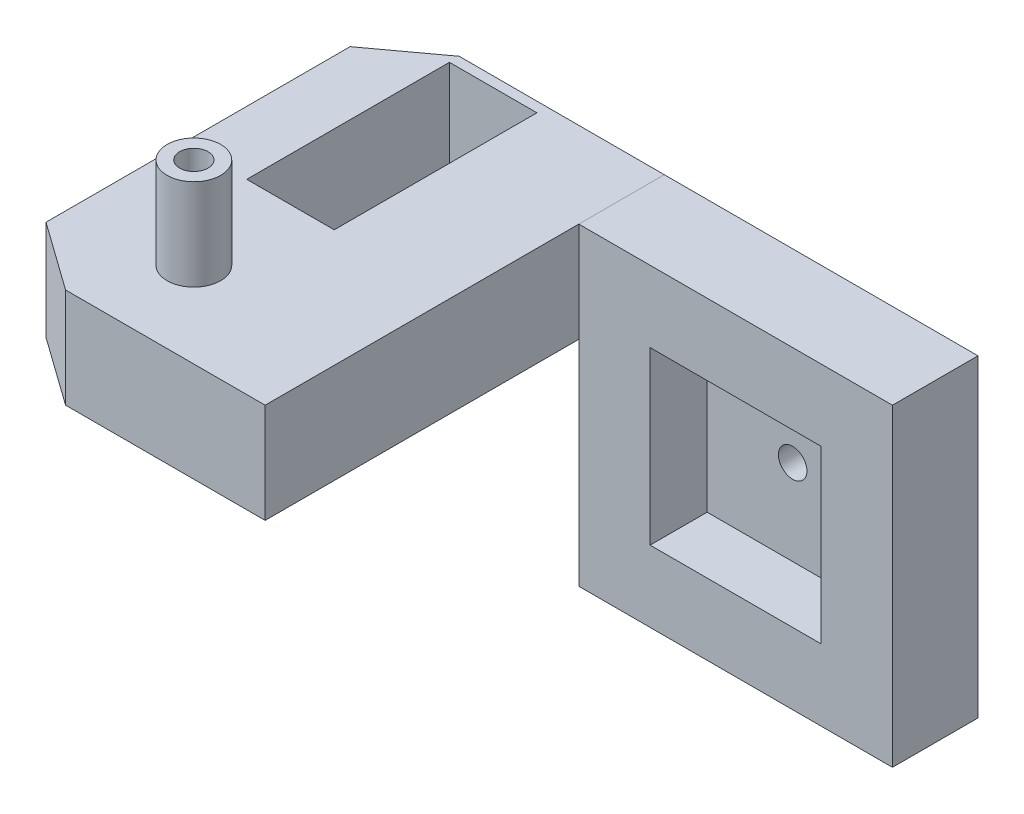
ISO-10303-21;
HEADER;
FILE_DESCRIPTION(('STEP AP214'),'2;1');
FILE_NAME('part.step','',(''),(''),'','','');
FILE_SCHEMA(('AUTOMOTIVE_DESIGN { 1 0 10303 214 1 1 1 1 }'));
ENDSEC;
DATA;
#1=APPLICATION_CONTEXT('core data for automotive mechanical design processes');
#2=APPLICATION_PROTOCOL_DEFINITION('international standard','automotive_design',2000,#1);
#3=PRODUCT_CONTEXT('',#1,'mechanical');
#4=PRODUCT('Part','Part','',(#3));
#5=PRODUCT_RELATED_PRODUCT_CATEGORY('part','',(#4));
#6=PRODUCT_DEFINITION_FORMATION('','',#4);
#7=PRODUCT_DEFINITION_CONTEXT('part definition',#1,'design');
#8=PRODUCT_DEFINITION('design','',#6,#7);
#9=PRODUCT_DEFINITION_SHAPE('','',#8);
#10=(LENGTH_UNIT() NAMED_UNIT(*) SI_UNIT(.MILLI.,.METRE.));
#11=(NAMED_UNIT(*) PLANE_ANGLE_UNIT() SI_UNIT($,.RADIAN.));
#12=(NAMED_UNIT(*) SI_UNIT($,.STERADIAN.) SOLID_ANGLE_UNIT());
#13=UNCERTAINTY_MEASURE_WITH_UNIT(LENGTH_MEASURE(1.E-05),#10,'distance_accuracy_value','');
#14=(GEOMETRIC_REPRESENTATION_CONTEXT(3) GLOBAL_UNCERTAINTY_ASSIGNED_CONTEXT((#13)) GLOBAL_UNIT_ASSIGNED_CONTEXT((#10,
#11,#12)) REPRESENTATION_CONTEXT('',''));
#15=CARTESIAN_POINT('',(0.,0.,0.));
#16=DIRECTION('',(0.,0.,1.));
#17=DIRECTION('',(1.,0.,0.));
#18=AXIS2_PLACEMENT_3D('',#15,#16,#17);
#19=CARTESIAN_POINT('',(-41.2496020360594,-0.64025842156578,70.));
#20=DIRECTION('',(0.,0.,1.));
#21=DIRECTION('',(1.,0.,0.));
#22=AXIS2_PLACEMENT_3D('',#19,#20,#21);
#23=PLANE('',#22);
#24=DIRECTION('',(1.,0.,0.));
#25=VECTOR('',#24,1.);
#26=CARTESIAN_POINT('',(-41.2496020360594,16.8597415784342,70.));
#27=LINE('',#26,#25);
#28=CARTESIAN_POINT('',(-76.2496020360593,16.8597415784342,70.));
#29=VERTEX_POINT('',#28);
#30=CARTESIAN_POINT('',(-41.2496020360594,16.8597415784342,70.));
#31=VERTEX_POINT('',#30);
#32=EDGE_CURVE('E241',#29,#31,#27,.T.);
#33=ORIENTED_EDGE('',*,*,#32,.F.);
#34=DIRECTION('',(0.,1.,0.));
#35=VECTOR('',#34,1.);
#36=CARTESIAN_POINT('',(-76.2496020360593,-38.1402584215658,70.));
#37=LINE('',#36,#35);
#38=CARTESIAN_POINT('',(-76.2496020360593,-0.64025842156578,70.));
#39=VERTEX_POINT('',#38);
#40=EDGE_CURVE('E216',#39,#29,#37,.T.);
#41=ORIENTED_EDGE('',*,*,#40,.F.);
#42=DIRECTION('',(1.,0.,0.));
#43=VECTOR('',#42,1.);
#44=CARTESIAN_POINT('',(-41.2496020360594,-0.64025842156578,70.));
#45=LINE('',#44,#43);
#46=CARTESIAN_POINT('',(-41.2496020360594,-0.64025842156578,70.));
#47=VERTEX_POINT('',#46);
#48=EDGE_CURVE('E244',#39,#47,#45,.T.);
#49=ORIENTED_EDGE('',*,*,#48,.T.);
#50=DIRECTION('',(0.,1.,0.));
#51=VECTOR('',#50,1.);
#52=CARTESIAN_POINT('',(-41.2496020360594,-0.64025842156578,70.));
#53=LINE('',#52,#51);
#54=EDGE_CURVE('E106',#47,#31,#53,.T.);
#55=ORIENTED_EDGE('',*,*,#54,.T.);
#56=EDGE_LOOP('',(#33,#41,#49,#55));
#57=FACE_BOUND('',#56,.T.);
#58=ADVANCED_FACE('F97',(#57),#23,.T.);
#59=CARTESIAN_POINT('',(-41.2496020360594,-0.64025842156578,0.));
#60=DIRECTION('',(1.,0.,0.));
#61=DIRECTION('',(0.,0.,-1.));
#62=AXIS2_PLACEMENT_3D('',#59,#60,#61);
#63=PLANE('',#62);
#64=DIRECTION('',(0.,0.,-1.));
#65=VECTOR('',#64,1.);
#66=CARTESIAN_POINT('',(-41.2496020360594,16.8597415784342,0.));
#67=LINE('',#66,#65);
#68=CARTESIAN_POINT('',(-41.2496020360594,16.8597415784342,0.));
#69=VERTEX_POINT('',#68);
#70=EDGE_CURVE('E236',#31,#69,#67,.T.);
#71=ORIENTED_EDGE('',*,*,#70,.F.);
#72=ORIENTED_EDGE('',*,*,#54,.F.);
#73=DIRECTION('',(0.,0.,-1.));
#74=VECTOR('',#73,1.);
#75=CARTESIAN_POINT('',(-41.2496020360594,-0.64025842156578,0.));
#76=LINE('',#75,#74);
#77=CARTESIAN_POINT('',(-41.2496020360594,-0.64025842156578,0.));
#78=VERTEX_POINT('',#77);
#79=EDGE_CURVE('E237',#47,#78,#76,.T.);
#80=ORIENTED_EDGE('',*,*,#79,.T.);
#81=DIRECTION('',(0.,1.,0.));
#82=VECTOR('',#81,1.);
#83=CARTESIAN_POINT('',(-41.2496020360594,-0.64025842156578,0.));
#84=LINE('',#83,#82);
#85=EDGE_CURVE('E101',#78,#69,#84,.T.);
#86=ORIENTED_EDGE('',*,*,#85,.T.);
#87=EDGE_LOOP('',(#71,#72,#80,#86));
#88=FACE_BOUND('',#87,.T.);
#89=ADVANCED_FACE('F99',(#88),#63,.T.);
#90=CARTESIAN_POINT('',(-41.2496020360594,-0.64025842156578,0.));
#91=DIRECTION('',(0.,0.,-1.));
#92=DIRECTION('',(-1.,0.,0.));
#93=AXIS2_PLACEMENT_3D('',#90,#91,#92);
#94=PLANE('',#93);
#95=DIRECTION('',(0.,1.,0.));
#96=VECTOR('',#95,1.);
#97=CARTESIAN_POINT('',(-77.2205527939733,-38.1402584215658,0.));
#98=LINE('',#97,#96);
#99=CARTESIAN_POINT('',(-77.2205527939733,-0.64025842156578,0.));
#100=VERTEX_POINT('',#99);
#101=CARTESIAN_POINT('',(-77.2205527939733,16.8597415784342,0.));
#102=VERTEX_POINT('',#101);
#103=EDGE_CURVE('E224',#100,#102,#98,.T.);
#104=ORIENTED_EDGE('',*,*,#103,.T.);
#105=DIRECTION('',(-1.,0.,0.));
#106=VECTOR('',#105,1.);
#107=CARTESIAN_POINT('',(-41.2496020360594,16.8597415784342,0.));
#108=LINE('',#107,#106);
#109=EDGE_CURVE('E248',#69,#102,#108,.T.);
#110=ORIENTED_EDGE('',*,*,#109,.F.);
#111=ORIENTED_EDGE('',*,*,#85,.F.);
#112=DIRECTION('',(-1.,0.,0.));
#113=VECTOR('',#112,1.);
#114=CARTESIAN_POINT('',(-41.2496020360594,-0.64025842156578,0.));
#115=LINE('',#114,#113);
#116=EDGE_CURVE('E240',#78,#100,#115,.T.);
#117=ORIENTED_EDGE('',*,*,#116,.T.);
#118=EDGE_LOOP('',(#104,#110,#111,#117));
#119=FACE_BOUND('',#118,.T.);
#120=ADVANCED_FACE('F261',(#119),#94,.T.);
#121=CARTESIAN_POINT('',(0.,-0.64025842156578,0.));
#122=DIRECTION('',(0.,-1.,0.));
#123=DIRECTION('',(0.,0.,-1.));
#124=AXIS2_PLACEMENT_3D('',#121,#122,#123);
#125=PLANE('',#124);
#126=DIRECTION('',(0.,0.,-1.));
#127=VECTOR('',#126,1.);
#128=CARTESIAN_POINT('',(-77.1593566180115,-0.64025842156578,0.));
#129=LINE('',#128,#127);
#130=CARTESIAN_POINT('',(-77.1593566180115,-0.64025842156578,37.3148076618371));
#131=VERTEX_POINT('',#130);
#132=CARTESIAN_POINT('',(-77.1593566180115,-0.64025842156578,1.77200194125743));
#133=VERTEX_POINT('',#132);
#134=EDGE_CURVE('E209',#131,#133,#129,.T.);
#135=ORIENTED_EDGE('',*,*,#134,.F.);
#136=DIRECTION('',(-1.,0.,0.));
#137=VECTOR('',#136,1.);
#138=CARTESIAN_POINT('',(0.,-0.64025842156578,37.3148076618371));
#139=LINE('',#138,#137);
#140=CARTESIAN_POINT('',(-61.8250269618374,-0.64025842156578,37.3148076618371));
#141=VERTEX_POINT('',#140);
#142=EDGE_CURVE('E202',#141,#131,#139,.T.);
#143=ORIENTED_EDGE('',*,*,#142,.F.);
#144=DIRECTION('',(0.,0.,1.));
#145=VECTOR('',#144,1.);
#146=CARTESIAN_POINT('',(-61.8250269618374,-0.64025842156578,0.));
#147=LINE('',#146,#145);
#148=CARTESIAN_POINT('',(-61.8250269618374,-0.64025842156578,1.77200194125743));
#149=VERTEX_POINT('',#148);
#150=EDGE_CURVE('E182',#149,#141,#147,.T.);
#151=ORIENTED_EDGE('',*,*,#150,.F.);
#152=DIRECTION('',(1.,0.,0.));
#153=VECTOR('',#152,1.);
#154=CARTESIAN_POINT('',(0.,-0.64025842156578,1.77200194125743));
#155=LINE('',#154,#153);
#156=EDGE_CURVE('E207',#133,#149,#155,.T.);
#157=ORIENTED_EDGE('',*,*,#156,.F.);
#158=EDGE_LOOP('',(#135,#143,#151,#157));
#159=FACE_BOUND('',#158,.T.);
#160=DIRECTION('',(-0.805892368460767,0.,0.592062066388901));
#161=VECTOR('',#160,1.);
#162=CARTESIAN_POINT('',(-27.0686987880782,-0.64025842156578,-36.8448833591483));
#163=LINE('',#162,#161);
#164=CARTESIAN_POINT('',(-88.2496020360594,-0.64025842156578,8.10267219311973));
#165=VERTEX_POINT('',#164);
#166=EDGE_CURVE('E231',#100,#165,#163,.T.);
#167=ORIENTED_EDGE('',*,*,#166,.F.);
#168=ORIENTED_EDGE('',*,*,#116,.F.);
#169=ORIENTED_EDGE('',*,*,#79,.F.);
#170=ORIENTED_EDGE('',*,*,#48,.F.);
#171=DIRECTION('',(-0.813733471206736,0.,-0.581238193719096));
#172=VECTOR('',#171,1.);
#173=CARTESIAN_POINT('',(-58.8681087959659,-0.64025842156578,82.4153523143524));
#174=LINE('',#173,#172);
#175=CARTESIAN_POINT('',(-88.2496020360594,-0.64025842156578,61.4285714285714));
#176=VERTEX_POINT('',#175);
#177=EDGE_CURVE('E219',#39,#176,#174,.T.);
#178=ORIENTED_EDGE('',*,*,#177,.T.);
#179=DIRECTION('',(0.,0.,-1.));
#180=VECTOR('',#179,1.);
#181=CARTESIAN_POINT('',(-88.2496020360594,-0.64025842156578,0.));
#182=LINE('',#181,#180);
#183=EDGE_CURVE('E233',#176,#165,#182,.T.);
#184=ORIENTED_EDGE('',*,*,#183,.T.);
#185=EDGE_LOOP('',(#167,#168,#169,#170,#178,#184));
#186=FACE_BOUND('',#185,.T.);
#187=ADVANCED_FACE('F269',(#159,#186),#125,.T.);
#188=CARTESIAN_POINT('',(0.,16.8597415784342,0.));
#189=DIRECTION('',(0.,-1.,0.));
#190=DIRECTION('',(0.,0.,-1.));
#191=AXIS2_PLACEMENT_3D('',#188,#189,#190);
#192=PLANE('',#191);
#193=CARTESIAN_POINT('',(-68.7496020360593,16.8597415784342,55.0000000000002));
#194=DIRECTION('',(0.,1.,0.));
#195=DIRECTION('',(0.,0.,1.));
#196=AXIS2_PLACEMENT_3D('',#193,#194,#195);
#197=CIRCLE('',#196,4.69999999999999);
#198=CARTESIAN_POINT('',(-68.7496020360593,16.8597415784342,59.7000000000002));
#199=VERTEX_POINT('',#198);
#200=EDGE_CURVE('E13',#199,#199,#197,.T.);
#201=ORIENTED_EDGE('',*,*,#200,.F.);
#202=EDGE_LOOP('',(#201));
#203=FACE_BOUND('',#202,.T.);
#204=DIRECTION('',(1.,0.,0.));
#205=VECTOR('',#204,1.);
#206=CARTESIAN_POINT('',(-77.1593566180115,16.8597415784342,37.3148076618371));
#207=LINE('',#206,#205);
#208=CARTESIAN_POINT('',(-77.1593566180115,16.8597415784342,37.3148076618371));
#209=VERTEX_POINT('',#208);
#210=CARTESIAN_POINT('',(-61.8250269618374,16.8597415784342,37.3148076618371));
#211=VERTEX_POINT('',#210);
#212=EDGE_CURVE('E188',#209,#211,#207,.T.);
#213=ORIENTED_EDGE('',*,*,#212,.F.);
#214=DIRECTION('',(0.,0.,1.));
#215=VECTOR('',#214,1.);
#216=CARTESIAN_POINT('',(-77.1593566180115,16.8597415784342,1.77200194125743));
#217=LINE('',#216,#215);
#218=CARTESIAN_POINT('',(-77.1593566180115,16.8597415784342,1.77200194125743));
#219=VERTEX_POINT('',#218);
#220=EDGE_CURVE('E122',#219,#209,#217,.T.);
#221=ORIENTED_EDGE('',*,*,#220,.F.);
#222=DIRECTION('',(-1.,0.,0.));
#223=VECTOR('',#222,1.);
#224=CARTESIAN_POINT('',(-77.1593566180115,16.8597415784342,1.77200194125743));
#225=LINE('',#224,#223);
#226=CARTESIAN_POINT('',(-61.8250269618374,16.8597415784342,1.77200194125743));
#227=VERTEX_POINT('',#226);
#228=EDGE_CURVE('E195',#227,#219,#225,.T.);
#229=ORIENTED_EDGE('',*,*,#228,.F.);
#230=DIRECTION('',(0.,0.,-1.));
#231=VECTOR('',#230,1.);
#232=CARTESIAN_POINT('',(-61.8250269618374,16.8597415784342,1.77200194125743));
#233=LINE('',#232,#231);
#234=EDGE_CURVE('E179',#211,#227,#233,.T.);
#235=ORIENTED_EDGE('',*,*,#234,.F.);
#236=EDGE_LOOP('',(#213,#221,#229,#235));
#237=FACE_BOUND('',#236,.T.);
#238=ORIENTED_EDGE('',*,*,#109,.T.);
#239=DIRECTION('',(0.805892368460767,0.,-0.592062066388901));
#240=VECTOR('',#239,1.);
#241=CARTESIAN_POINT('',(-111.249602036059,16.8597415784342,25.));
#242=LINE('',#241,#240);
#243=CARTESIAN_POINT('',(-88.2496020360594,16.8597415784342,8.10267219311973));
#244=VERTEX_POINT('',#243);
#245=EDGE_CURVE('E211',#244,#102,#242,.T.);
#246=ORIENTED_EDGE('',*,*,#245,.F.);
#247=DIRECTION('',(0.,0.,1.));
#248=VECTOR('',#247,1.);
#249=CARTESIAN_POINT('',(-88.2496020360594,16.8597415784342,0.));
#250=LINE('',#249,#248);
#251=CARTESIAN_POINT('',(-88.2496020360594,16.8597415784342,61.4285714285714));
#252=VERTEX_POINT('',#251);
#253=EDGE_CURVE('E212',#244,#252,#250,.T.);
#254=ORIENTED_EDGE('',*,*,#253,.T.);
#255=DIRECTION('',(0.813733471206735,0.,0.581238193719096));
#256=VECTOR('',#255,1.);
#257=CARTESIAN_POINT('',(-111.249602036059,16.8597415784342,45.));
#258=LINE('',#257,#256);
#259=EDGE_CURVE('E221',#252,#29,#258,.T.);
#260=ORIENTED_EDGE('',*,*,#259,.T.);
#261=ORIENTED_EDGE('',*,*,#32,.T.);
#262=ORIENTED_EDGE('',*,*,#70,.T.);
#263=EDGE_LOOP('',(#238,#246,#254,#260,#261,#262));
#264=FACE_BOUND('',#263,.T.);
#265=ADVANCED_FACE('F192',(#203,#237,#264),#192,.F.);
#266=CARTESIAN_POINT('',(-88.2496020360594,-38.1402584215658,0.));
#267=DIRECTION('',(-1.,0.,0.));
#268=DIRECTION('',(0.,0.,1.));
#269=AXIS2_PLACEMENT_3D('',#266,#267,#268);
#270=PLANE('',#269);
#271=DIRECTION('',(0.,1.,0.));
#272=VECTOR('',#271,1.);
#273=CARTESIAN_POINT('',(-88.2496020360594,-38.1402584215658,61.4285714285714));
#274=LINE('',#273,#272);
#275=EDGE_CURVE('E217',#176,#252,#274,.T.);
#276=ORIENTED_EDGE('',*,*,#275,.T.);
#277=ORIENTED_EDGE('',*,*,#253,.F.);
#278=DIRECTION('',(0.,1.,0.));
#279=VECTOR('',#278,1.);
#280=CARTESIAN_POINT('',(-88.2496020360594,-38.1402584215658,8.10267219311973));
#281=LINE('',#280,#279);
#282=EDGE_CURVE('E215',#165,#244,#281,.T.);
#283=ORIENTED_EDGE('',*,*,#282,.F.);
#284=ORIENTED_EDGE('',*,*,#183,.F.);
#285=EDGE_LOOP('',(#276,#277,#283,#284));
#286=FACE_BOUND('',#285,.T.);
#287=ADVANCED_FACE('F275',(#286),#270,.T.);
#288=CARTESIAN_POINT('',(-111.249602036059,-38.1402584215658,25.));
#289=DIRECTION('',(0.592062066388901,0.,0.805892368460767));
#290=DIRECTION('',(0.805892368460767,0.,-0.592062066388901));
#291=AXIS2_PLACEMENT_3D('',#288,#289,#290);
#292=PLANE('',#291);
#293=ORIENTED_EDGE('',*,*,#166,.T.);
#294=ORIENTED_EDGE('',*,*,#282,.T.);
#295=ORIENTED_EDGE('',*,*,#245,.T.);
#296=ORIENTED_EDGE('',*,*,#103,.F.);
#297=EDGE_LOOP('',(#293,#294,#295,#296));
#298=FACE_BOUND('',#297,.T.);
#299=ADVANCED_FACE('F272',(#298),#292,.F.);
#300=CARTESIAN_POINT('',(-111.249602036059,-38.1402584215658,45.));
#301=DIRECTION('',(-0.581238193719096,0.,0.813733471206736));
#302=DIRECTION('',(0.813733471206736,0.,0.581238193719096));
#303=AXIS2_PLACEMENT_3D('',#300,#301,#302);
#304=PLANE('',#303);
#305=ORIENTED_EDGE('',*,*,#40,.T.);
#306=ORIENTED_EDGE('',*,*,#259,.F.);
#307=ORIENTED_EDGE('',*,*,#275,.F.);
#308=ORIENTED_EDGE('',*,*,#177,.F.);
#309=EDGE_LOOP('',(#305,#306,#307,#308));
#310=FACE_BOUND('',#309,.T.);
#311=ADVANCED_FACE('F277',(#310),#304,.T.);
#312=CARTESIAN_POINT('',(-77.1593566180115,-38.1402584215658,1.77200194125743));
#313=DIRECTION('',(-1.,0.,0.));
#314=DIRECTION('',(0.,0.,1.));
#315=AXIS2_PLACEMENT_3D('',#312,#313,#314);
#316=PLANE('',#315);
#317=ORIENTED_EDGE('',*,*,#134,.T.);
#318=DIRECTION('',(0.,1.,0.));
#319=VECTOR('',#318,1.);
#320=CARTESIAN_POINT('',(-77.1593566180115,-38.1402584215658,1.77200194125743));
#321=LINE('',#320,#319);
#322=EDGE_CURVE('E200',#133,#219,#321,.T.);
#323=ORIENTED_EDGE('',*,*,#322,.T.);
#324=ORIENTED_EDGE('',*,*,#220,.T.);
#325=DIRECTION('',(0.,1.,0.));
#326=VECTOR('',#325,1.);
#327=CARTESIAN_POINT('',(-77.1593566180115,-38.1402584215658,37.3148076618371));
#328=LINE('',#327,#326);
#329=EDGE_CURVE('E185',#131,#209,#328,.T.);
#330=ORIENTED_EDGE('',*,*,#329,.F.);
#331=EDGE_LOOP('',(#317,#323,#324,#330));
#332=FACE_BOUND('',#331,.T.);
#333=ADVANCED_FACE('F279',(#332),#316,.F.);
#334=CARTESIAN_POINT('',(-77.1593566180115,-38.1402584215658,1.77200194125743));
#335=DIRECTION('',(0.,0.,-1.));
#336=DIRECTION('',(-1.,0.,0.));
#337=AXIS2_PLACEMENT_3D('',#334,#335,#336);
#338=PLANE('',#337);
#339=ORIENTED_EDGE('',*,*,#156,.T.);
#340=DIRECTION('',(0.,1.,0.));
#341=VECTOR('',#340,1.);
#342=CARTESIAN_POINT('',(-61.8250269618374,-38.1402584215658,1.77200194125743));
#343=LINE('',#342,#341);
#344=EDGE_CURVE('E184',#149,#227,#343,.T.);
#345=ORIENTED_EDGE('',*,*,#344,.T.);
#346=ORIENTED_EDGE('',*,*,#228,.T.);
#347=ORIENTED_EDGE('',*,*,#322,.F.);
#348=EDGE_LOOP('',(#339,#345,#346,#347));
#349=FACE_BOUND('',#348,.T.);
#350=ADVANCED_FACE('F286',(#349),#338,.F.);
#351=CARTESIAN_POINT('',(-61.8250269618374,-38.1402584215658,1.77200194125743));
#352=DIRECTION('',(1.,0.,0.));
#353=DIRECTION('',(0.,0.,-1.));
#354=AXIS2_PLACEMENT_3D('',#351,#352,#353);
#355=PLANE('',#354);
#356=ORIENTED_EDGE('',*,*,#150,.T.);
#357=DIRECTION('',(0.,1.,0.));
#358=VECTOR('',#357,1.);
#359=CARTESIAN_POINT('',(-61.8250269618374,-38.1402584215658,37.3148076618371));
#360=LINE('',#359,#358);
#361=EDGE_CURVE('E114',#141,#211,#360,.T.);
#362=ORIENTED_EDGE('',*,*,#361,.T.);
#363=ORIENTED_EDGE('',*,*,#234,.T.);
#364=ORIENTED_EDGE('',*,*,#344,.F.);
#365=EDGE_LOOP('',(#356,#362,#363,#364));
#366=FACE_BOUND('',#365,.T.);
#367=ADVANCED_FACE('F176',(#366),#355,.F.);
#368=CARTESIAN_POINT('',(-77.1593566180115,-38.1402584215658,37.3148076618371));
#369=DIRECTION('',(0.,0.,1.));
#370=DIRECTION('',(1.,0.,0.));
#371=AXIS2_PLACEMENT_3D('',#368,#369,#370);
#372=PLANE('',#371);
#373=ORIENTED_EDGE('',*,*,#142,.T.);
#374=ORIENTED_EDGE('',*,*,#329,.T.);
#375=ORIENTED_EDGE('',*,*,#212,.T.);
#376=ORIENTED_EDGE('',*,*,#361,.F.);
#377=EDGE_LOOP('',(#373,#374,#375,#376));
#378=FACE_BOUND('',#377,.T.);
#379=ADVANCED_FACE('F189',(#378),#372,.F.);
#380=CARTESIAN_POINT('',(-68.7496020360593,32.8597415784342,55.0000000000002));
#381=DIRECTION('',(0.,-1.,0.));
#382=DIRECTION('',(0.,0.,-1.));
#383=AXIS2_PLACEMENT_3D('',#380,#381,#382);
#384=CYLINDRICAL_SURFACE('',#383,4.69999999999999);
#385=CARTESIAN_POINT('',(-68.7496020360593,32.8597415784342,55.0000000000002));
#386=DIRECTION('',(0.,1.,0.));
#387=DIRECTION('',(0.,0.,1.));
#388=AXIS2_PLACEMENT_3D('',#385,#386,#387);
#389=CIRCLE('',#388,4.69999999999999);
#390=CARTESIAN_POINT('',(-68.7496020360593,32.8597415784342,59.7000000000002));
#391=VERTEX_POINT('',#390);
#392=EDGE_CURVE('E310',#391,#391,#389,.T.);
#393=ORIENTED_EDGE('',*,*,#392,.F.);
#394=EDGE_LOOP('',(#393));
#395=FACE_BOUND('',#394,.T.);
#396=ORIENTED_EDGE('',*,*,#200,.T.);
#397=EDGE_LOOP('',(#396));
#398=FACE_BOUND('',#397,.T.);
#399=ADVANCED_FACE('F332',(#395,#398),#384,.T.);
#400=CARTESIAN_POINT('',(-68.7496020360593,32.8597415784342,55.0000000000002));
#401=DIRECTION('',(0.,1.,0.));
#402=DIRECTION('',(0.,0.,1.));
#403=AXIS2_PLACEMENT_3D('',#400,#401,#402);
#404=PLANE('',#403);
#405=CARTESIAN_POINT('',(-68.7496020360593,32.8597415784342,55.0000000000002));
#406=DIRECTION('',(0.,1.,0.));
#407=DIRECTION('',(0.,0.,1.));
#408=AXIS2_PLACEMENT_3D('',#405,#406,#407);
#409=CIRCLE('',#408,2.5);
#410=CARTESIAN_POINT('',(-68.7496020360593,32.8597415784342,57.5000000000002));
#411=VERTEX_POINT('',#410);
#412=EDGE_CURVE('E315',#411,#411,#409,.T.);
#413=ORIENTED_EDGE('',*,*,#412,.F.);
#414=EDGE_LOOP('',(#413));
#415=FACE_BOUND('',#414,.T.);
#416=ORIENTED_EDGE('',*,*,#392,.T.);
#417=EDGE_LOOP('',(#416));
#418=FACE_BOUND('',#417,.T.);
#419=ADVANCED_FACE('F326',(#415,#418),#404,.T.);
#420=CARTESIAN_POINT('',(-68.7496020360593,22.8597415784342,55.0000000000002));
#421=DIRECTION('',(0.,1.,0.));
#422=DIRECTION('',(0.,0.,1.));
#423=AXIS2_PLACEMENT_3D('',#420,#421,#422);
#424=CYLINDRICAL_SURFACE('',#423,2.5);
#425=CARTESIAN_POINT('',(-68.7496020360593,22.8597415784342,55.0000000000002));
#426=DIRECTION('',(0.,1.,0.));
#427=DIRECTION('',(0.,0.,1.));
#428=AXIS2_PLACEMENT_3D('',#425,#426,#427);
#429=CIRCLE('',#428,2.5);
#430=CARTESIAN_POINT('',(-68.7496020360593,22.8597415784342,57.5000000000002));
#431=VERTEX_POINT('',#430);
#432=EDGE_CURVE('E312',#431,#431,#429,.T.);
#433=ORIENTED_EDGE('',*,*,#432,.F.);
#434=EDGE_LOOP('',(#433));
#435=FACE_BOUND('',#434,.T.);
#436=ORIENTED_EDGE('',*,*,#412,.T.);
#437=EDGE_LOOP('',(#436));
#438=FACE_BOUND('',#437,.T.);
#439=ADVANCED_FACE('F323',(#435,#438),#424,.F.);
#440=CARTESIAN_POINT('',(-68.7496020360593,22.8597415784342,55.0000000000002));
#441=DIRECTION('',(0.,1.,0.));
#442=DIRECTION('',(0.,0.,1.));
#443=AXIS2_PLACEMENT_3D('',#440,#441,#442);
#444=PLANE('',#443);
#445=ORIENTED_EDGE('',*,*,#432,.T.);
#446=EDGE_LOOP('',(#445));
#447=FACE_BOUND('',#446,.T.);
#448=ADVANCED_FACE('F321',(#447),#444,.T.);
#449=CLOSED_SHELL('',(#58,#89,#120,#187,#265,#287,#299,#311,#333,#350,#367,#379,#399,#419,#439,#448));
#450=MANIFOLD_SOLID_BREP('B2',#449);
#451=CARTESIAN_POINT('',(0.,16.8597415784342,15.));
#452=DIRECTION('',(0.,1.,0.));
#453=DIRECTION('',(0.,0.,1.));
#454=AXIS2_PLACEMENT_3D('',#451,#452,#453);
#455=PLANE('',#454);
#456=DIRECTION('',(1.,0.,0.));
#457=VECTOR('',#456,1.);
#458=CARTESIAN_POINT('',(0.,16.8597415784342,0.));
#459=LINE('',#458,#457);
#460=CARTESIAN_POINT('',(-41.2496020360594,16.8597415784342,0.));
#461=VERTEX_POINT('',#460);
#462=CARTESIAN_POINT('',(13.7503979639406,16.8597415784342,0.));
#463=VERTEX_POINT('',#462);
#464=EDGE_CURVE('E531',#461,#463,#459,.T.);
#465=ORIENTED_EDGE('',*,*,#464,.F.);
#466=DIRECTION('',(0.,0.,-1.));
#467=VECTOR('',#466,1.);
#468=CARTESIAN_POINT('',(-41.2496020360594,16.8597415784342,15.));
#469=LINE('',#468,#467);
#470=CARTESIAN_POINT('',(-41.2496020360594,16.8597415784342,15.));
#471=VERTEX_POINT('',#470);
#472=EDGE_CURVE('E95',#471,#461,#469,.T.);
#473=ORIENTED_EDGE('',*,*,#472,.F.);
#474=DIRECTION('',(1.,0.,0.));
#475=VECTOR('',#474,1.);
#476=CARTESIAN_POINT('',(0.,16.8597415784342,15.));
#477=LINE('',#476,#475);
#478=CARTESIAN_POINT('',(13.7503979639406,16.8597415784342,15.));
#479=VERTEX_POINT('',#478);
#480=EDGE_CURVE('E541',#471,#479,#477,.T.);
#481=ORIENTED_EDGE('',*,*,#480,.T.);
#482=DIRECTION('',(0.,0.,-1.));
#483=VECTOR('',#482,1.);
#484=CARTESIAN_POINT('',(13.7503979639406,16.8597415784342,15.));
#485=LINE('',#484,#483);
#486=EDGE_CURVE('E562',#479,#463,#485,.T.);
#487=ORIENTED_EDGE('',*,*,#486,.T.);
#488=EDGE_LOOP('',(#465,#473,#481,#487));
#489=FACE_BOUND('',#488,.T.);
#490=ADVANCED_FACE('F439',(#489),#455,.T.);
#491=CARTESIAN_POINT('',(-41.2496020360594,0.,15.));
#492=DIRECTION('',(1.,0.,0.));
#493=DIRECTION('',(0.,1.,0.));
#494=AXIS2_PLACEMENT_3D('',#491,#492,#493);
#495=PLANE('',#494);
#496=DIRECTION('',(0.,-1.,0.));
#497=VECTOR('',#496,1.);
#498=CARTESIAN_POINT('',(-41.2496020360594,0.,0.));
#499=LINE('',#498,#497);
#500=CARTESIAN_POINT('',(-41.2496020360594,-38.1402584215658,0.));
#501=VERTEX_POINT('',#500);
#502=EDGE_CURVE('E554',#461,#501,#499,.T.);
#503=ORIENTED_EDGE('',*,*,#502,.T.);
#504=DIRECTION('',(0.,0.,-1.));
#505=VECTOR('',#504,1.);
#506=CARTESIAN_POINT('',(-41.2496020360594,-38.1402584215658,15.));
#507=LINE('',#506,#505);
#508=CARTESIAN_POINT('',(-41.2496020360594,-38.1402584215658,15.));
#509=VERTEX_POINT('',#508);
#510=EDGE_CURVE('E448',#509,#501,#507,.T.);
#511=ORIENTED_EDGE('',*,*,#510,.F.);
#512=DIRECTION('',(0.,-1.,0.));
#513=VECTOR('',#512,1.);
#514=CARTESIAN_POINT('',(-41.2496020360594,0.,15.));
#515=LINE('',#514,#513);
#516=EDGE_CURVE('E544',#471,#509,#515,.T.);
#517=ORIENTED_EDGE('',*,*,#516,.F.);
#518=ORIENTED_EDGE('',*,*,#472,.T.);
#519=EDGE_LOOP('',(#503,#511,#517,#518));
#520=FACE_BOUND('',#519,.T.);
#521=ADVANCED_FACE('F586',(#520),#495,.F.);
#522=CARTESIAN_POINT('',(0.,-38.1402584215658,15.));
#523=DIRECTION('',(0.,1.,0.));
#524=DIRECTION('',(0.,0.,1.));
#525=AXIS2_PLACEMENT_3D('',#522,#523,#524);
#526=PLANE('',#525);
#527=DIRECTION('',(1.,0.,0.));
#528=VECTOR('',#527,1.);
#529=CARTESIAN_POINT('',(0.,-38.1402584215658,0.));
#530=LINE('',#529,#528);
#531=CARTESIAN_POINT('',(13.7503979639406,-38.1402584215658,0.));
#532=VERTEX_POINT('',#531);
#533=EDGE_CURVE('E557',#501,#532,#530,.T.);
#534=ORIENTED_EDGE('',*,*,#533,.T.);
#535=DIRECTION('',(0.,0.,-1.));
#536=VECTOR('',#535,1.);
#537=CARTESIAN_POINT('',(13.7503979639406,-38.1402584215658,15.));
#538=LINE('',#537,#536);
#539=CARTESIAN_POINT('',(13.7503979639406,-38.1402584215658,15.));
#540=VERTEX_POINT('',#539);
#541=EDGE_CURVE('E564',#540,#532,#538,.T.);
#542=ORIENTED_EDGE('',*,*,#541,.F.);
#543=DIRECTION('',(1.,0.,0.));
#544=VECTOR('',#543,1.);
#545=CARTESIAN_POINT('',(0.,-38.1402584215658,15.));
#546=LINE('',#545,#544);
#547=EDGE_CURVE('E547',#509,#540,#546,.T.);
#548=ORIENTED_EDGE('',*,*,#547,.F.);
#549=ORIENTED_EDGE('',*,*,#510,.T.);
#550=EDGE_LOOP('',(#534,#542,#548,#549));
#551=FACE_BOUND('',#550,.T.);
#552=ADVANCED_FACE('F588',(#551),#526,.F.);
#553=CARTESIAN_POINT('',(-28.7496020360594,0.,15.));
#554=DIRECTION('',(1.,0.,0.));
#555=DIRECTION('',(0.,1.,0.));
#556=AXIS2_PLACEMENT_3D('',#553,#554,#555);
#557=PLANE('',#556);
#558=DIRECTION('',(0.,-1.,0.));
#559=VECTOR('',#558,1.);
#560=CARTESIAN_POINT('',(-28.7496020360594,4.35974157843422,4.99999999999989));
#561=LINE('',#560,#559);
#562=CARTESIAN_POINT('',(-28.7496020360594,4.35974157843425,4.99999999999989));
#563=VERTEX_POINT('',#562);
#564=CARTESIAN_POINT('',(-28.7496020360594,-25.6402584215657,4.99999999999989));
#565=VERTEX_POINT('',#564);
#566=EDGE_CURVE('E456',#563,#565,#561,.T.);
#567=ORIENTED_EDGE('',*,*,#566,.F.);
#568=DIRECTION('',(0.,0.,-1.));
#569=VECTOR('',#568,1.);
#570=CARTESIAN_POINT('',(-28.7496020360594,4.35974157843425,15.));
#571=LINE('',#570,#569);
#572=CARTESIAN_POINT('',(-28.7496020360594,4.35974157843425,15.));
#573=VERTEX_POINT('',#572);
#574=EDGE_CURVE('E443',#573,#563,#571,.T.);
#575=ORIENTED_EDGE('',*,*,#574,.F.);
#576=DIRECTION('',(0.,-1.,0.));
#577=VECTOR('',#576,1.);
#578=CARTESIAN_POINT('',(-28.7496020360594,0.,15.));
#579=LINE('',#578,#577);
#580=CARTESIAN_POINT('',(-28.7496020360594,-25.6402584215657,15.));
#581=VERTEX_POINT('',#580);
#582=EDGE_CURVE('E532',#573,#581,#579,.T.);
#583=ORIENTED_EDGE('',*,*,#582,.T.);
#584=DIRECTION('',(0.,0.,-1.));
#585=VECTOR('',#584,1.);
#586=CARTESIAN_POINT('',(-28.7496020360594,-25.6402584215657,15.));
#587=LINE('',#586,#585);
#588=EDGE_CURVE('E517',#581,#565,#587,.T.);
#589=ORIENTED_EDGE('',*,*,#588,.T.);
#590=EDGE_LOOP('',(#567,#575,#583,#589));
#591=FACE_BOUND('',#590,.T.);
#592=ADVANCED_FACE('F441',(#591),#557,.T.);
#593=CARTESIAN_POINT('',(0.,4.35974157843425,15.));
#594=DIRECTION('',(0.,1.,0.));
#595=DIRECTION('',(-1.,0.,0.));
#596=AXIS2_PLACEMENT_3D('',#593,#594,#595);
#597=PLANE('',#596);
#598=ORIENTED_EDGE('',*,*,#574,.T.);
#599=DIRECTION('',(-1.,0.,0.));
#600=VECTOR('',#599,1.);
#601=CARTESIAN_POINT('',(-28.7496020360594,4.35974157843422,4.99999999999989));
#602=LINE('',#601,#600);
#603=CARTESIAN_POINT('',(1.25039796394065,4.35974157843425,4.99999999999989));
#604=VERTEX_POINT('',#603);
#605=EDGE_CURVE('E463',#604,#563,#602,.T.);
#606=ORIENTED_EDGE('',*,*,#605,.F.);
#607=DIRECTION('',(0.,0.,-1.));
#608=VECTOR('',#607,1.);
#609=CARTESIAN_POINT('',(1.25039796394065,4.35974157843425,15.));
#610=LINE('',#609,#608);
#611=CARTESIAN_POINT('',(1.25039796394065,4.35974157843425,15.));
#612=VERTEX_POINT('',#611);
#613=EDGE_CURVE('E516',#612,#604,#610,.T.);
#614=ORIENTED_EDGE('',*,*,#613,.F.);
#615=DIRECTION('',(1.,0.,0.));
#616=VECTOR('',#615,1.);
#617=CARTESIAN_POINT('',(0.,4.35974157843425,15.));
#618=LINE('',#617,#616);
#619=EDGE_CURVE('E535',#573,#612,#618,.T.);
#620=ORIENTED_EDGE('',*,*,#619,.F.);
#621=EDGE_LOOP('',(#598,#606,#614,#620));
#622=FACE_BOUND('',#621,.T.);
#623=ADVANCED_FACE('F569',(#622),#597,.F.);
#624=CARTESIAN_POINT('',(1.25039796394065,0.,15.));
#625=DIRECTION('',(1.,0.,0.));
#626=DIRECTION('',(0.,1.,0.));
#627=AXIS2_PLACEMENT_3D('',#624,#625,#626);
#628=PLANE('',#627);
#629=ORIENTED_EDGE('',*,*,#613,.T.);
#630=DIRECTION('',(0.,1.,0.));
#631=VECTOR('',#630,1.);
#632=CARTESIAN_POINT('',(1.25039796394055,4.35974157843422,4.99999999999989));
#633=LINE('',#632,#631);
#634=CARTESIAN_POINT('',(1.25039796394066,-25.6402584215657,4.99999999999989));
#635=VERTEX_POINT('',#634);
#636=EDGE_CURVE('E520',#635,#604,#633,.T.);
#637=ORIENTED_EDGE('',*,*,#636,.F.);
#638=DIRECTION('',(0.,0.,-1.));
#639=VECTOR('',#638,1.);
#640=CARTESIAN_POINT('',(1.25039796394065,-25.6402584215657,15.));
#641=LINE('',#640,#639);
#642=CARTESIAN_POINT('',(1.25039796394065,-25.6402584215657,15.));
#643=VERTEX_POINT('',#642);
#644=EDGE_CURVE('E507',#643,#635,#641,.T.);
#645=ORIENTED_EDGE('',*,*,#644,.F.);
#646=DIRECTION('',(0.,-1.,0.));
#647=VECTOR('',#646,1.);
#648=CARTESIAN_POINT('',(1.25039796394065,0.,15.));
#649=LINE('',#648,#647);
#650=EDGE_CURVE('E538',#612,#643,#649,.T.);
#651=ORIENTED_EDGE('',*,*,#650,.F.);
#652=EDGE_LOOP('',(#629,#637,#645,#651));
#653=FACE_BOUND('',#652,.T.);
#654=ADVANCED_FACE('F521',(#653),#628,.F.);
#655=CARTESIAN_POINT('',(0.,-25.6402584215657,15.));
#656=DIRECTION('',(0.,1.,0.));
#657=DIRECTION('',(0.,0.,1.));
#658=AXIS2_PLACEMENT_3D('',#655,#656,#657);
#659=PLANE('',#658);
#660=DIRECTION('',(1.,0.,0.));
#661=VECTOR('',#660,1.);
#662=CARTESIAN_POINT('',(-28.7496020360594,-25.6402584215657,4.99999999999989));
#663=LINE('',#662,#661);
#664=EDGE_CURVE('E511',#565,#635,#663,.T.);
#665=ORIENTED_EDGE('',*,*,#664,.F.);
#666=ORIENTED_EDGE('',*,*,#588,.F.);
#667=DIRECTION('',(1.,0.,0.));
#668=VECTOR('',#667,1.);
#669=CARTESIAN_POINT('',(0.,-25.6402584215657,15.));
#670=LINE('',#669,#668);
#671=EDGE_CURVE('E513',#581,#643,#670,.T.);
#672=ORIENTED_EDGE('',*,*,#671,.T.);
#673=ORIENTED_EDGE('',*,*,#644,.T.);
#674=EDGE_LOOP('',(#665,#666,#672,#673));
#675=FACE_BOUND('',#674,.T.);
#676=ADVANCED_FACE('F509',(#675),#659,.T.);
#677=CARTESIAN_POINT('',(13.7503979639406,0.,15.));
#678=DIRECTION('',(1.,0.,0.));
#679=DIRECTION('',(0.,0.,-1.));
#680=AXIS2_PLACEMENT_3D('',#677,#678,#679);
#681=PLANE('',#680);
#682=DIRECTION('',(0.,-1.,0.));
#683=VECTOR('',#682,1.);
#684=CARTESIAN_POINT('',(13.7503979639406,0.,0.));
#685=LINE('',#684,#683);
#686=EDGE_CURVE('E536',#463,#532,#685,.T.);
#687=ORIENTED_EDGE('',*,*,#686,.F.);
#688=ORIENTED_EDGE('',*,*,#486,.F.);
#689=DIRECTION('',(0.,-1.,0.));
#690=VECTOR('',#689,1.);
#691=CARTESIAN_POINT('',(13.7503979639406,0.,15.));
#692=LINE('',#691,#690);
#693=EDGE_CURVE('E549',#479,#540,#692,.T.);
#694=ORIENTED_EDGE('',*,*,#693,.T.);
#695=ORIENTED_EDGE('',*,*,#541,.T.);
#696=EDGE_LOOP('',(#687,#688,#694,#695));
#697=FACE_BOUND('',#696,.T.);
#698=ADVANCED_FACE('F576',(#697),#681,.T.);
#699=CARTESIAN_POINT('',(0.,0.,15.));
#700=DIRECTION('',(0.,0.,1.));
#701=DIRECTION('',(1.,0.,0.));
#702=AXIS2_PLACEMENT_3D('',#699,#700,#701);
#703=PLANE('',#702);
#704=ORIENTED_EDGE('',*,*,#582,.F.);
#705=ORIENTED_EDGE('',*,*,#619,.T.);
#706=ORIENTED_EDGE('',*,*,#650,.T.);
#707=ORIENTED_EDGE('',*,*,#671,.F.);
#708=EDGE_LOOP('',(#704,#705,#706,#707));
#709=FACE_BOUND('',#708,.T.);
#710=ORIENTED_EDGE('',*,*,#480,.F.);
#711=ORIENTED_EDGE('',*,*,#516,.T.);
#712=ORIENTED_EDGE('',*,*,#547,.T.);
#713=ORIENTED_EDGE('',*,*,#693,.F.);
#714=EDGE_LOOP('',(#710,#711,#712,#713));
#715=FACE_BOUND('',#714,.T.);
#716=ADVANCED_FACE('F572',(#709,#715),#703,.T.);
#717=CARTESIAN_POINT('',(0.,0.,0.));
#718=DIRECTION('',(0.,0.,1.));
#719=DIRECTION('',(1.,0.,0.));
#720=AXIS2_PLACEMENT_3D('',#717,#718,#719);
#721=PLANE('',#720);
#722=CARTESIAN_POINT('',(-13.7496020360595,-10.6402584215658,0.));
#723=DIRECTION('',(0.,0.,1.));
#724=DIRECTION('',(1.,0.,0.));
#725=AXIS2_PLACEMENT_3D('',#722,#723,#724);
#726=CIRCLE('',#725,2.49999999999995);
#727=CARTESIAN_POINT('',(-11.2496020360595,-10.6402584215658,0.));
#728=VERTEX_POINT('',#727);
#729=EDGE_CURVE('E526',#728,#728,#726,.T.);
#730=ORIENTED_EDGE('',*,*,#729,.T.);
#731=EDGE_LOOP('',(#730));
#732=FACE_BOUND('',#731,.T.);
#733=ORIENTED_EDGE('',*,*,#464,.T.);
#734=ORIENTED_EDGE('',*,*,#686,.T.);
#735=ORIENTED_EDGE('',*,*,#533,.F.);
#736=ORIENTED_EDGE('',*,*,#502,.F.);
#737=EDGE_LOOP('',(#733,#734,#735,#736));
#738=FACE_BOUND('',#737,.T.);
#739=ADVANCED_FACE('F575',(#732,#738),#721,.F.);
#740=CARTESIAN_POINT('',(0.,0.,4.99999999999989));
#741=DIRECTION('',(0.,0.,1.));
#742=DIRECTION('',(1.,0.,0.));
#743=AXIS2_PLACEMENT_3D('',#740,#741,#742);
#744=PLANE('',#743);
#745=CARTESIAN_POINT('',(-13.7496020360595,-10.6402584215658,4.99999999999989));
#746=DIRECTION('',(0.,0.,1.));
#747=DIRECTION('',(1.,0.,0.));
#748=AXIS2_PLACEMENT_3D('',#745,#746,#747);
#749=CIRCLE('',#748,2.49999999999995);
#750=CARTESIAN_POINT('',(-11.2496020360595,-10.6402584215658,4.99999999999989));
#751=VERTEX_POINT('',#750);
#752=EDGE_CURVE('E668',#751,#751,#749,.T.);
#753=ORIENTED_EDGE('',*,*,#752,.F.);
#754=EDGE_LOOP('',(#753));
#755=FACE_BOUND('',#754,.T.);
#756=ORIENTED_EDGE('',*,*,#566,.T.);
#757=ORIENTED_EDGE('',*,*,#664,.T.);
#758=ORIENTED_EDGE('',*,*,#636,.T.);
#759=ORIENTED_EDGE('',*,*,#605,.T.);
#760=EDGE_LOOP('',(#756,#757,#758,#759));
#761=FACE_BOUND('',#760,.T.);
#762=ADVANCED_FACE('F524',(#755,#761),#744,.T.);
#763=CARTESIAN_POINT('',(-13.7496020360595,-10.6402584215658,0.));
#764=DIRECTION('',(0.,0.,1.));
#765=DIRECTION('',(1.,0.,0.));
#766=AXIS2_PLACEMENT_3D('',#763,#764,#765);
#767=CYLINDRICAL_SURFACE('',#766,2.49999999999995);
#768=ORIENTED_EDGE('',*,*,#729,.F.);
#769=EDGE_LOOP('',(#768));
#770=FACE_BOUND('',#769,.T.);
#771=ORIENTED_EDGE('',*,*,#752,.T.);
#772=EDGE_LOOP('',(#771));
#773=FACE_BOUND('',#772,.T.);
#774=ADVANCED_FACE('F600',(#770,#773),#767,.F.);
#775=CLOSED_SHELL('',(#490,#521,#552,#592,#623,#654,#676,#698,#716,#739,#762,#774));
#776=MANIFOLD_SOLID_BREP('B7',#775);
#777=ADVANCED_BREP_SHAPE_REPRESENTATION('',(#18,#450,#776),#14);
#778=SHAPE_DEFINITION_REPRESENTATION(#9,#777);
ENDSEC;
END-ISO-10303-21;
